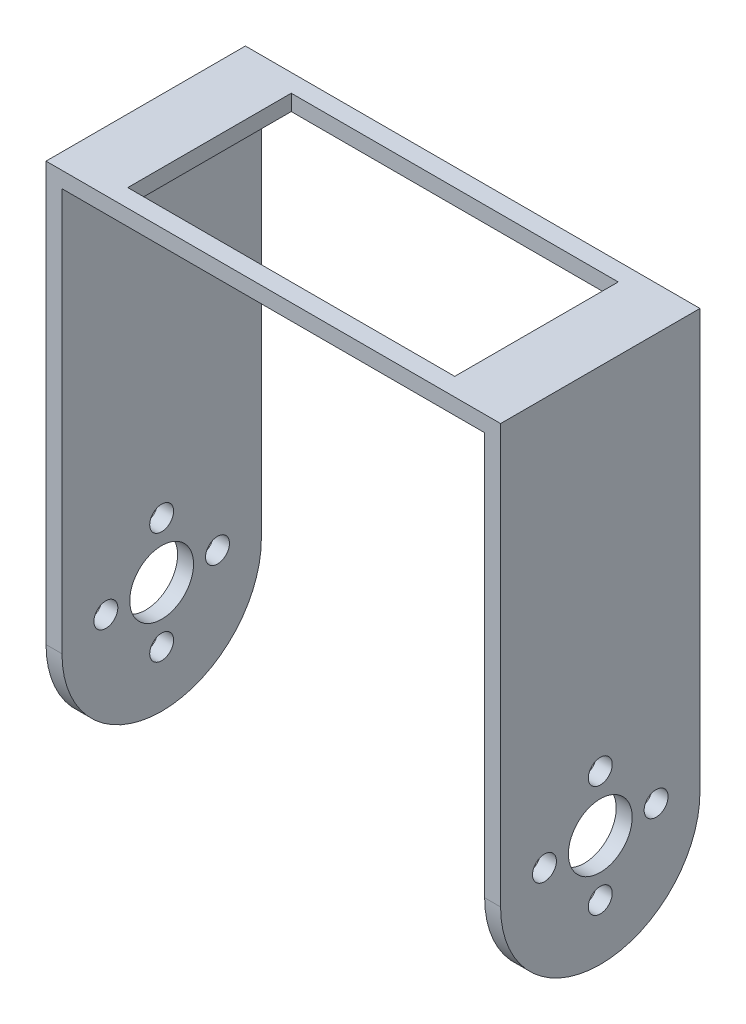
ISO-10303-21;
HEADER;
FILE_DESCRIPTION(('STEP AP214'),'2;1');
FILE_NAME('part.step','',(''),(''),'','','');
FILE_SCHEMA(('AUTOMOTIVE_DESIGN { 1 0 10303 214 1 1 1 1 }'));
ENDSEC;
DATA;
#1=APPLICATION_CONTEXT('core data for automotive mechanical design processes');
#2=APPLICATION_PROTOCOL_DEFINITION('international standard','automotive_design',2000,#1);
#3=PRODUCT_CONTEXT('',#1,'mechanical');
#4=PRODUCT('Part','Part','',(#3));
#5=PRODUCT_RELATED_PRODUCT_CATEGORY('part','',(#4));
#6=PRODUCT_DEFINITION_FORMATION('','',#4);
#7=PRODUCT_DEFINITION_CONTEXT('part definition',#1,'design');
#8=PRODUCT_DEFINITION('design','',#6,#7);
#9=PRODUCT_DEFINITION_SHAPE('','',#8);
#10=(LENGTH_UNIT() NAMED_UNIT(*) SI_UNIT(.MILLI.,.METRE.));
#11=(NAMED_UNIT(*) PLANE_ANGLE_UNIT() SI_UNIT($,.RADIAN.));
#12=(NAMED_UNIT(*) SI_UNIT($,.STERADIAN.) SOLID_ANGLE_UNIT());
#13=UNCERTAINTY_MEASURE_WITH_UNIT(LENGTH_MEASURE(1.E-05),#10,'distance_accuracy_value','');
#14=(GEOMETRIC_REPRESENTATION_CONTEXT(3) GLOBAL_UNCERTAINTY_ASSIGNED_CONTEXT((#13)) GLOBAL_UNIT_ASSIGNED_CONTEXT((#10,
#11,#12)) REPRESENTATION_CONTEXT('',''));
#15=CARTESIAN_POINT('',(0.,0.,0.));
#16=DIRECTION('',(0.,0.,1.));
#17=DIRECTION('',(1.,0.,0.));
#18=AXIS2_PLACEMENT_3D('',#15,#16,#17);
#19=CARTESIAN_POINT('',(-79.925523148209,43.3899538371544,25.));
#20=DIRECTION('',(-1.,0.,0.));
#21=DIRECTION('',(0.,0.,1.));
#22=AXIS2_PLACEMENT_3D('',#19,#20,#21);
#23=PLANE('',#22);
#24=CARTESIAN_POINT('',(-79.925523148209,-5.61350156427675,19.5000009937423));
#25=DIRECTION('',(-1.,0.,0.));
#26=DIRECTION('',(0.,0.,1.));
#27=AXIS2_PLACEMENT_3D('',#24,#25,#26);
#28=CIRCLE('',#27,1.5);
#29=CARTESIAN_POINT('',(-79.925523148209,-5.61350156427675,21.0000009937423));
#30=VERTEX_POINT('',#29);
#31=EDGE_CURVE('E168',#30,#30,#28,.T.);
#32=ORIENTED_EDGE('',*,*,#31,.T.);
#33=EDGE_LOOP('',(#32));
#34=FACE_BOUND('',#33,.T.);
#35=CARTESIAN_POINT('',(-79.925523148209,-12.6135015642767,12.5000009937423));
#36=DIRECTION('',(-1.,0.,0.));
#37=DIRECTION('',(0.,0.,1.));
#38=AXIS2_PLACEMENT_3D('',#35,#36,#37);
#39=CIRCLE('',#38,1.5);
#40=CARTESIAN_POINT('',(-79.925523148209,-12.6135015642767,14.0000009937423));
#41=VERTEX_POINT('',#40);
#42=EDGE_CURVE('E180',#41,#41,#39,.T.);
#43=ORIENTED_EDGE('',*,*,#42,.T.);
#44=EDGE_LOOP('',(#43));
#45=FACE_BOUND('',#44,.T.);
#46=CARTESIAN_POINT('',(-79.925523148209,-5.61350156427665,5.50000099374234));
#47=DIRECTION('',(-1.,0.,0.));
#48=DIRECTION('',(0.,0.,1.));
#49=AXIS2_PLACEMENT_3D('',#46,#47,#48);
#50=CIRCLE('',#49,1.5);
#51=CARTESIAN_POINT('',(-79.925523148209,-5.61350156427665,7.00000099374234));
#52=VERTEX_POINT('',#51);
#53=EDGE_CURVE('E192',#52,#52,#50,.T.);
#54=ORIENTED_EDGE('',*,*,#53,.T.);
#55=EDGE_LOOP('',(#54));
#56=FACE_BOUND('',#55,.T.);
#57=CARTESIAN_POINT('',(-79.925523148209,1.38649843572328,12.5000009937424));
#58=DIRECTION('',(-1.,0.,0.));
#59=DIRECTION('',(0.,0.,1.));
#60=AXIS2_PLACEMENT_3D('',#57,#58,#59);
#61=CIRCLE('',#60,1.5);
#62=CARTESIAN_POINT('',(-79.925523148209,1.38649843572328,14.0000009937424));
#63=VERTEX_POINT('',#62);
#64=EDGE_CURVE('E204',#63,#63,#61,.T.);
#65=ORIENTED_EDGE('',*,*,#64,.T.);
#66=EDGE_LOOP('',(#65));
#67=FACE_BOUND('',#66,.T.);
#68=CARTESIAN_POINT('',(-79.925523148209,-5.61349741649557,12.5));
#69=DIRECTION('',(-1.,0.,0.));
#70=DIRECTION('',(0.,0.,1.));
#71=AXIS2_PLACEMENT_3D('',#68,#69,#70);
#72=CIRCLE('',#71,4.);
#73=CARTESIAN_POINT('',(-79.925523148209,-5.61349741649557,16.5));
#74=VERTEX_POINT('',#73);
#75=EDGE_CURVE('E230',#74,#74,#72,.T.);
#76=ORIENTED_EDGE('',*,*,#75,.T.);
#77=EDGE_LOOP('',(#76));
#78=FACE_BOUND('',#77,.T.);
#79=DIRECTION('',(0.,1.,0.));
#80=VECTOR('',#79,1.);
#81=CARTESIAN_POINT('',(-79.925523148209,43.3899538371544,25.));
#82=LINE('',#81,#80);
#83=CARTESIAN_POINT('',(-79.925523148209,-7.11349741649558,25.));
#84=VERTEX_POINT('',#83);
#85=CARTESIAN_POINT('',(-79.925523148209,43.3899538371544,25.));
#86=VERTEX_POINT('',#85);
#87=EDGE_CURVE('E234',#84,#86,#82,.T.);
#88=ORIENTED_EDGE('',*,*,#87,.F.);
#89=CARTESIAN_POINT('',(-79.925523148209,-7.11349741649558,12.5));
#90=DIRECTION('',(-1.,0.,0.));
#91=DIRECTION('',(0.,0.,1.));
#92=AXIS2_PLACEMENT_3D('',#89,#90,#91);
#93=CIRCLE('',#92,12.5);
#94=CARTESIAN_POINT('',(-79.925523148209,-7.11349741649558,0.));
#95=VERTEX_POINT('',#94);
#96=EDGE_CURVE('E219',#95,#84,#93,.T.);
#97=ORIENTED_EDGE('',*,*,#96,.F.);
#98=DIRECTION('',(0.,1.,0.));
#99=VECTOR('',#98,1.);
#100=CARTESIAN_POINT('',(-79.925523148209,43.3899538371544,0.));
#101=LINE('',#100,#99);
#102=CARTESIAN_POINT('',(-79.925523148209,43.3899538371544,0.));
#103=VERTEX_POINT('',#102);
#104=EDGE_CURVE('E233',#95,#103,#101,.T.);
#105=ORIENTED_EDGE('',*,*,#104,.T.);
#106=DIRECTION('',(0.,0.,-1.));
#107=VECTOR('',#106,1.);
#108=CARTESIAN_POINT('',(-79.925523148209,43.3899538371544,25.));
#109=LINE('',#108,#107);
#110=EDGE_CURVE('E270',#86,#103,#109,.T.);
#111=ORIENTED_EDGE('',*,*,#110,.F.);
#112=EDGE_LOOP('',(#88,#97,#105,#111));
#113=FACE_BOUND('',#112,.T.);
#114=ADVANCED_FACE('F34',(#34,#45,#56,#67,#78,#113),#23,.F.);
#115=CARTESIAN_POINT('',(-26.925523148209,43.3899538371544,25.));
#116=DIRECTION('',(1.,0.,0.));
#117=DIRECTION('',(0.,1.,0.));
#118=AXIS2_PLACEMENT_3D('',#115,#116,#117);
#119=PLANE('',#118);
#120=CARTESIAN_POINT('',(-26.925523148209,-5.61350156427673,19.5000009937423));
#121=DIRECTION('',(1.,0.,0.));
#122=DIRECTION('',(0.,1.,0.));
#123=AXIS2_PLACEMENT_3D('',#120,#121,#122);
#124=CIRCLE('',#123,1.5);
#125=CARTESIAN_POINT('',(-26.925523148209,-4.11350156427673,19.5000009937423));
#126=VERTEX_POINT('',#125);
#127=EDGE_CURVE('E163',#126,#126,#124,.T.);
#128=ORIENTED_EDGE('',*,*,#127,.T.);
#129=EDGE_LOOP('',(#128));
#130=FACE_BOUND('',#129,.T.);
#131=CARTESIAN_POINT('',(-26.925523148209,-12.6135015642767,12.5000009937423));
#132=DIRECTION('',(1.,0.,0.));
#133=DIRECTION('',(0.,1.,0.));
#134=AXIS2_PLACEMENT_3D('',#131,#132,#133);
#135=CIRCLE('',#134,1.5);
#136=CARTESIAN_POINT('',(-26.925523148209,-11.1135015642767,12.5000009937423));
#137=VERTEX_POINT('',#136);
#138=EDGE_CURVE('E175',#137,#137,#135,.T.);
#139=ORIENTED_EDGE('',*,*,#138,.T.);
#140=EDGE_LOOP('',(#139));
#141=FACE_BOUND('',#140,.T.);
#142=CARTESIAN_POINT('',(-26.925523148209,-5.61350156427663,5.50000099374234));
#143=DIRECTION('',(1.,0.,0.));
#144=DIRECTION('',(0.,1.,0.));
#145=AXIS2_PLACEMENT_3D('',#142,#143,#144);
#146=CIRCLE('',#145,1.5);
#147=CARTESIAN_POINT('',(-26.925523148209,-4.11350156427663,5.50000099374234));
#148=VERTEX_POINT('',#147);
#149=EDGE_CURVE('E187',#148,#148,#146,.T.);
#150=ORIENTED_EDGE('',*,*,#149,.T.);
#151=EDGE_LOOP('',(#150));
#152=FACE_BOUND('',#151,.T.);
#153=CARTESIAN_POINT('',(-26.925523148209,1.3864984357233,12.5000009937424));
#154=DIRECTION('',(1.,0.,0.));
#155=DIRECTION('',(0.,1.,0.));
#156=AXIS2_PLACEMENT_3D('',#153,#154,#155);
#157=CIRCLE('',#156,1.5);
#158=CARTESIAN_POINT('',(-26.925523148209,2.8864984357233,12.5000009937424));
#159=VERTEX_POINT('',#158);
#160=EDGE_CURVE('E199',#159,#159,#157,.T.);
#161=ORIENTED_EDGE('',*,*,#160,.T.);
#162=EDGE_LOOP('',(#161));
#163=FACE_BOUND('',#162,.T.);
#164=CARTESIAN_POINT('',(-26.925523148209,-5.61349741649556,12.5));
#165=DIRECTION('',(1.,0.,0.));
#166=DIRECTION('',(0.,1.,0.));
#167=AXIS2_PLACEMENT_3D('',#164,#165,#166);
#168=CIRCLE('',#167,4.);
#169=CARTESIAN_POINT('',(-26.925523148209,-1.61349741649556,12.5));
#170=VERTEX_POINT('',#169);
#171=EDGE_CURVE('E225',#170,#170,#168,.T.);
#172=ORIENTED_EDGE('',*,*,#171,.T.);
#173=EDGE_LOOP('',(#172));
#174=FACE_BOUND('',#173,.T.);
#175=CARTESIAN_POINT('',(-26.925523148209,-7.11349741649557,12.5));
#176=DIRECTION('',(1.,0.,0.));
#177=DIRECTION('',(0.,1.,0.));
#178=AXIS2_PLACEMENT_3D('',#175,#176,#177);
#179=CIRCLE('',#178,12.5);
#180=CARTESIAN_POINT('',(-26.925523148209,-7.11349741649557,25.));
#181=VERTEX_POINT('',#180);
#182=CARTESIAN_POINT('',(-26.925523148209,-7.11349741649558,0.));
#183=VERTEX_POINT('',#182);
#184=EDGE_CURVE('E217',#181,#183,#179,.T.);
#185=ORIENTED_EDGE('',*,*,#184,.F.);
#186=DIRECTION('',(0.,-1.,0.));
#187=VECTOR('',#186,1.);
#188=CARTESIAN_POINT('',(-26.925523148209,43.3899538371544,25.));
#189=LINE('',#188,#187);
#190=CARTESIAN_POINT('',(-26.925523148209,43.3899538371544,25.));
#191=VERTEX_POINT('',#190);
#192=EDGE_CURVE('E239',#191,#181,#189,.T.);
#193=ORIENTED_EDGE('',*,*,#192,.F.);
#194=DIRECTION('',(0.,0.,-1.));
#195=VECTOR('',#194,1.);
#196=CARTESIAN_POINT('',(-26.925523148209,43.3899538371544,25.));
#197=LINE('',#196,#195);
#198=CARTESIAN_POINT('',(-26.925523148209,43.3899538371544,0.));
#199=VERTEX_POINT('',#198);
#200=EDGE_CURVE('E267',#191,#199,#197,.T.);
#201=ORIENTED_EDGE('',*,*,#200,.T.);
#202=DIRECTION('',(0.,-1.,0.));
#203=VECTOR('',#202,1.);
#204=CARTESIAN_POINT('',(-26.925523148209,43.3899538371544,0.));
#205=LINE('',#204,#203);
#206=EDGE_CURVE('E253',#199,#183,#205,.T.);
#207=ORIENTED_EDGE('',*,*,#206,.T.);
#208=EDGE_LOOP('',(#185,#193,#201,#207));
#209=FACE_BOUND('',#208,.T.);
#210=ADVANCED_FACE('F302',(#130,#141,#152,#163,#174,#209),#119,.F.);
#211=CARTESIAN_POINT('',(-24.925523148209,45.3865025835044,25.));
#212=DIRECTION('',(-1.,0.,0.));
#213=DIRECTION('',(0.,-1.,0.));
#214=AXIS2_PLACEMENT_3D('',#211,#212,#213);
#215=PLANE('',#214);
#216=CARTESIAN_POINT('',(-24.925523148209,-5.61350156427673,19.5000009937423));
#217=DIRECTION('',(1.,0.,0.));
#218=DIRECTION('',(0.,1.,0.));
#219=AXIS2_PLACEMENT_3D('',#216,#217,#218);
#220=CIRCLE('',#219,1.5);
#221=CARTESIAN_POINT('',(-24.925523148209,-4.11350156427673,19.5000009937423));
#222=VERTEX_POINT('',#221);
#223=EDGE_CURVE('E159',#222,#222,#220,.T.);
#224=ORIENTED_EDGE('',*,*,#223,.F.);
#225=EDGE_LOOP('',(#224));
#226=FACE_BOUND('',#225,.T.);
#227=CARTESIAN_POINT('',(-24.925523148209,-12.6135015642767,12.5000009937423));
#228=DIRECTION('',(1.,0.,0.));
#229=DIRECTION('',(0.,1.,0.));
#230=AXIS2_PLACEMENT_3D('',#227,#228,#229);
#231=CIRCLE('',#230,1.5);
#232=CARTESIAN_POINT('',(-24.925523148209,-11.1135015642767,12.5000009937423));
#233=VERTEX_POINT('',#232);
#234=EDGE_CURVE('E171',#233,#233,#231,.T.);
#235=ORIENTED_EDGE('',*,*,#234,.F.);
#236=EDGE_LOOP('',(#235));
#237=FACE_BOUND('',#236,.T.);
#238=CARTESIAN_POINT('',(-24.925523148209,-5.61350156427663,5.50000099374234));
#239=DIRECTION('',(1.,0.,0.));
#240=DIRECTION('',(0.,1.,0.));
#241=AXIS2_PLACEMENT_3D('',#238,#239,#240);
#242=CIRCLE('',#241,1.5);
#243=CARTESIAN_POINT('',(-24.925523148209,-4.11350156427663,5.50000099374234));
#244=VERTEX_POINT('',#243);
#245=EDGE_CURVE('E183',#244,#244,#242,.T.);
#246=ORIENTED_EDGE('',*,*,#245,.F.);
#247=EDGE_LOOP('',(#246));
#248=FACE_BOUND('',#247,.T.);
#249=CARTESIAN_POINT('',(-24.925523148209,1.3864984357233,12.5000009937424));
#250=DIRECTION('',(1.,0.,0.));
#251=DIRECTION('',(0.,1.,0.));
#252=AXIS2_PLACEMENT_3D('',#249,#250,#251);
#253=CIRCLE('',#252,1.5);
#254=CARTESIAN_POINT('',(-24.925523148209,2.8864984357233,12.5000009937424));
#255=VERTEX_POINT('',#254);
#256=EDGE_CURVE('E195',#255,#255,#253,.T.);
#257=ORIENTED_EDGE('',*,*,#256,.F.);
#258=EDGE_LOOP('',(#257));
#259=FACE_BOUND('',#258,.T.);
#260=CARTESIAN_POINT('',(-24.9255231482089,-5.61349741649556,12.5));
#261=DIRECTION('',(-1.,0.,0.));
#262=DIRECTION('',(0.,-1.,0.));
#263=AXIS2_PLACEMENT_3D('',#260,#261,#262);
#264=CIRCLE('',#263,4.);
#265=CARTESIAN_POINT('',(-24.9255231482089,-9.61349741649556,12.5));
#266=VERTEX_POINT('',#265);
#267=EDGE_CURVE('E222',#266,#266,#264,.T.);
#268=ORIENTED_EDGE('',*,*,#267,.T.);
#269=EDGE_LOOP('',(#268));
#270=FACE_BOUND('',#269,.T.);
#271=DIRECTION('',(0.,1.,0.));
#272=VECTOR('',#271,1.);
#273=CARTESIAN_POINT('',(-24.925523148209,45.3865025835044,25.));
#274=LINE('',#273,#272);
#275=CARTESIAN_POINT('',(-24.9255231482089,-7.11349741649557,25.));
#276=VERTEX_POINT('',#275);
#277=CARTESIAN_POINT('',(-24.925523148209,45.3865025835044,25.));
#278=VERTEX_POINT('',#277);
#279=EDGE_CURVE('E242',#276,#278,#274,.T.);
#280=ORIENTED_EDGE('',*,*,#279,.F.);
#281=CARTESIAN_POINT('',(-24.9255231482089,-7.11349741649557,12.5));
#282=DIRECTION('',(-1.,0.,0.));
#283=DIRECTION('',(0.,-1.,0.));
#284=AXIS2_PLACEMENT_3D('',#281,#282,#283);
#285=CIRCLE('',#284,12.5);
#286=CARTESIAN_POINT('',(-24.9255231482089,-7.11349741649557,0.));
#287=VERTEX_POINT('',#286);
#288=EDGE_CURVE('E211',#287,#276,#285,.T.);
#289=ORIENTED_EDGE('',*,*,#288,.F.);
#290=DIRECTION('',(0.,1.,0.));
#291=VECTOR('',#290,1.);
#292=CARTESIAN_POINT('',(-24.925523148209,45.3865025835044,0.));
#293=LINE('',#292,#291);
#294=CARTESIAN_POINT('',(-24.925523148209,45.3865025835044,0.));
#295=VERTEX_POINT('',#294);
#296=EDGE_CURVE('E256',#287,#295,#293,.T.);
#297=ORIENTED_EDGE('',*,*,#296,.T.);
#298=DIRECTION('',(0.,0.,-1.));
#299=VECTOR('',#298,1.);
#300=CARTESIAN_POINT('',(-24.925523148209,45.3865025835044,25.));
#301=LINE('',#300,#299);
#302=EDGE_CURVE('E264',#278,#295,#301,.T.);
#303=ORIENTED_EDGE('',*,*,#302,.F.);
#304=EDGE_LOOP('',(#280,#289,#297,#303));
#305=FACE_BOUND('',#304,.T.);
#306=ADVANCED_FACE('F292',(#226,#237,#248,#259,#270,#305),#215,.F.);
#307=CARTESIAN_POINT('',(-81.925523148209,45.3865025835044,25.));
#308=DIRECTION('',(1.,0.,0.));
#309=DIRECTION('',(0.,1.,0.));
#310=AXIS2_PLACEMENT_3D('',#307,#308,#309);
#311=PLANE('',#310);
#312=CARTESIAN_POINT('',(-81.925523148209,-5.61350156427675,19.5000009937423));
#313=DIRECTION('',(1.,0.,0.));
#314=DIRECTION('',(0.,1.,0.));
#315=AXIS2_PLACEMENT_3D('',#312,#313,#314);
#316=CIRCLE('',#315,1.5);
#317=CARTESIAN_POINT('',(-81.925523148209,-4.11350156427675,19.5000009937423));
#318=VERTEX_POINT('',#317);
#319=EDGE_CURVE('E160',#318,#318,#316,.T.);
#320=ORIENTED_EDGE('',*,*,#319,.T.);
#321=EDGE_LOOP('',(#320));
#322=FACE_BOUND('',#321,.T.);
#323=CARTESIAN_POINT('',(-81.925523148209,-12.6135015642767,12.5000009937423));
#324=DIRECTION('',(1.,0.,0.));
#325=DIRECTION('',(0.,1.,0.));
#326=AXIS2_PLACEMENT_3D('',#323,#324,#325);
#327=CIRCLE('',#326,1.5);
#328=CARTESIAN_POINT('',(-81.925523148209,-11.1135015642767,12.5000009937423));
#329=VERTEX_POINT('',#328);
#330=EDGE_CURVE('E172',#329,#329,#327,.T.);
#331=ORIENTED_EDGE('',*,*,#330,.T.);
#332=EDGE_LOOP('',(#331));
#333=FACE_BOUND('',#332,.T.);
#334=CARTESIAN_POINT('',(-81.925523148209,-5.61350156427665,5.50000099374234));
#335=DIRECTION('',(1.,0.,0.));
#336=DIRECTION('',(0.,1.,0.));
#337=AXIS2_PLACEMENT_3D('',#334,#335,#336);
#338=CIRCLE('',#337,1.5);
#339=CARTESIAN_POINT('',(-81.925523148209,-4.11350156427665,5.50000099374234));
#340=VERTEX_POINT('',#339);
#341=EDGE_CURVE('E184',#340,#340,#338,.T.);
#342=ORIENTED_EDGE('',*,*,#341,.T.);
#343=EDGE_LOOP('',(#342));
#344=FACE_BOUND('',#343,.T.);
#345=CARTESIAN_POINT('',(-81.925523148209,1.38649843572328,12.5000009937424));
#346=DIRECTION('',(1.,0.,0.));
#347=DIRECTION('',(0.,1.,0.));
#348=AXIS2_PLACEMENT_3D('',#345,#346,#347);
#349=CIRCLE('',#348,1.5);
#350=CARTESIAN_POINT('',(-81.925523148209,2.88649843572328,12.5000009937424));
#351=VERTEX_POINT('',#350);
#352=EDGE_CURVE('E196',#351,#351,#349,.T.);
#353=ORIENTED_EDGE('',*,*,#352,.T.);
#354=EDGE_LOOP('',(#353));
#355=FACE_BOUND('',#354,.T.);
#356=CARTESIAN_POINT('',(-81.925523148209,-5.61349741649557,12.5));
#357=DIRECTION('',(-1.,0.,0.));
#358=DIRECTION('',(0.,-1.,0.));
#359=AXIS2_PLACEMENT_3D('',#356,#357,#358);
#360=CIRCLE('',#359,4.);
#361=CARTESIAN_POINT('',(-81.925523148209,-9.61349741649557,12.5));
#362=VERTEX_POINT('',#361);
#363=EDGE_CURVE('E221',#362,#362,#360,.T.);
#364=ORIENTED_EDGE('',*,*,#363,.F.);
#365=EDGE_LOOP('',(#364));
#366=FACE_BOUND('',#365,.T.);
#367=CARTESIAN_POINT('',(-81.925523148209,-7.11349741649558,12.5));
#368=DIRECTION('',(-1.,0.,0.));
#369=DIRECTION('',(0.,-1.,0.));
#370=AXIS2_PLACEMENT_3D('',#367,#368,#369);
#371=CIRCLE('',#370,12.5);
#372=CARTESIAN_POINT('',(-81.925523148209,-7.11349741649558,0.));
#373=VERTEX_POINT('',#372);
#374=CARTESIAN_POINT('',(-81.925523148209,-7.11349741649558,25.));
#375=VERTEX_POINT('',#374);
#376=EDGE_CURVE('E210',#373,#375,#371,.T.);
#377=ORIENTED_EDGE('',*,*,#376,.T.);
#378=DIRECTION('',(0.,-1.,0.));
#379=VECTOR('',#378,1.);
#380=CARTESIAN_POINT('',(-81.925523148209,45.3865025835044,25.));
#381=LINE('',#380,#379);
#382=CARTESIAN_POINT('',(-81.925523148209,45.3865025835044,25.));
#383=VERTEX_POINT('',#382);
#384=EDGE_CURVE('E246',#383,#375,#381,.T.);
#385=ORIENTED_EDGE('',*,*,#384,.F.);
#386=DIRECTION('',(0.,0.,-1.));
#387=VECTOR('',#386,1.);
#388=CARTESIAN_POINT('',(-81.925523148209,45.3865025835044,25.));
#389=LINE('',#388,#387);
#390=CARTESIAN_POINT('',(-81.925523148209,45.3865025835044,0.));
#391=VERTEX_POINT('',#390);
#392=EDGE_CURVE('E249',#383,#391,#389,.T.);
#393=ORIENTED_EDGE('',*,*,#392,.T.);
#394=DIRECTION('',(0.,-1.,0.));
#395=VECTOR('',#394,1.);
#396=CARTESIAN_POINT('',(-81.925523148209,45.3865025835044,0.));
#397=LINE('',#396,#395);
#398=EDGE_CURVE('E237',#391,#373,#397,.T.);
#399=ORIENTED_EDGE('',*,*,#398,.T.);
#400=EDGE_LOOP('',(#377,#385,#393,#399));
#401=FACE_BOUND('',#400,.T.);
#402=ADVANCED_FACE('F283',(#322,#333,#344,#355,#366,#401),#311,.F.);
#403=CARTESIAN_POINT('',(-79.925523148209,43.3899538371544,25.));
#404=DIRECTION('',(0.,1.,0.));
#405=DIRECTION('',(0.,0.,1.));
#406=AXIS2_PLACEMENT_3D('',#403,#404,#405);
#407=PLANE('',#406);
#408=DIRECTION('',(1.,0.,0.));
#409=VECTOR('',#408,1.);
#410=CARTESIAN_POINT('',(-79.925523148209,43.3899538371544,22.75));
#411=LINE('',#410,#409);
#412=CARTESIAN_POINT('',(-73.925523148209,43.3899538371544,22.75));
#413=VERTEX_POINT('',#412);
#414=CARTESIAN_POINT('',(-32.925523148209,43.3899538371544,22.75));
#415=VERTEX_POINT('',#414);
#416=EDGE_CURVE('E153',#413,#415,#411,.T.);
#417=ORIENTED_EDGE('',*,*,#416,.T.);
#418=DIRECTION('',(0.,0.,-1.));
#419=VECTOR('',#418,1.);
#420=CARTESIAN_POINT('',(-32.925523148209,43.3899538371544,25.));
#421=LINE('',#420,#419);
#422=CARTESIAN_POINT('',(-32.925523148209,43.3899538371544,2.25));
#423=VERTEX_POINT('',#422);
#424=EDGE_CURVE('E156',#415,#423,#421,.T.);
#425=ORIENTED_EDGE('',*,*,#424,.T.);
#426=DIRECTION('',(-1.,0.,0.));
#427=VECTOR('',#426,1.);
#428=CARTESIAN_POINT('',(-79.925523148209,43.3899538371544,2.25));
#429=LINE('',#428,#427);
#430=CARTESIAN_POINT('',(-73.925523148209,43.3899538371544,2.25));
#431=VERTEX_POINT('',#430);
#432=EDGE_CURVE('E148',#423,#431,#429,.T.);
#433=ORIENTED_EDGE('',*,*,#432,.T.);
#434=DIRECTION('',(0.,0.,1.));
#435=VECTOR('',#434,1.);
#436=CARTESIAN_POINT('',(-73.925523148209,43.3899538371544,25.));
#437=LINE('',#436,#435);
#438=EDGE_CURVE('E128',#431,#413,#437,.T.);
#439=ORIENTED_EDGE('',*,*,#438,.T.);
#440=EDGE_LOOP('',(#417,#425,#433,#439));
#441=FACE_BOUND('',#440,.T.);
#442=DIRECTION('',(1.,0.,0.));
#443=VECTOR('',#442,1.);
#444=CARTESIAN_POINT('',(-79.925523148209,43.3899538371544,0.));
#445=LINE('',#444,#443);
#446=EDGE_CURVE('E251',#103,#199,#445,.T.);
#447=ORIENTED_EDGE('',*,*,#446,.T.);
#448=ORIENTED_EDGE('',*,*,#200,.F.);
#449=DIRECTION('',(1.,0.,0.));
#450=VECTOR('',#449,1.);
#451=CARTESIAN_POINT('',(-79.925523148209,43.3899538371544,25.));
#452=LINE('',#451,#450);
#453=EDGE_CURVE('E236',#86,#191,#452,.T.);
#454=ORIENTED_EDGE('',*,*,#453,.F.);
#455=ORIENTED_EDGE('',*,*,#110,.T.);
#456=EDGE_LOOP('',(#447,#448,#454,#455));
#457=FACE_BOUND('',#456,.T.);
#458=ADVANCED_FACE('F305',(#441,#457),#407,.F.);
#459=CARTESIAN_POINT('',(-81.925523148209,45.3865025835044,25.));
#460=DIRECTION('',(0.,-1.,0.));
#461=DIRECTION('',(0.,0.,-1.));
#462=AXIS2_PLACEMENT_3D('',#459,#460,#461);
#463=PLANE('',#462);
#464=DIRECTION('',(-1.,0.,0.));
#465=VECTOR('',#464,1.);
#466=CARTESIAN_POINT('',(-73.925523148209,45.3865025835044,2.25));
#467=LINE('',#466,#465);
#468=CARTESIAN_POINT('',(-32.925523148209,45.3865025835044,2.25));
#469=VERTEX_POINT('',#468);
#470=CARTESIAN_POINT('',(-73.925523148209,45.3865025835044,2.25));
#471=VERTEX_POINT('',#470);
#472=EDGE_CURVE('E134',#469,#471,#467,.T.);
#473=ORIENTED_EDGE('',*,*,#472,.F.);
#474=DIRECTION('',(0.,0.,-1.));
#475=VECTOR('',#474,1.);
#476=CARTESIAN_POINT('',(-32.925523148209,45.3865025835044,2.25));
#477=LINE('',#476,#475);
#478=CARTESIAN_POINT('',(-32.925523148209,45.3865025835044,22.75));
#479=VERTEX_POINT('',#478);
#480=EDGE_CURVE('E56',#479,#469,#477,.T.);
#481=ORIENTED_EDGE('',*,*,#480,.F.);
#482=DIRECTION('',(1.,0.,0.));
#483=VECTOR('',#482,1.);
#484=CARTESIAN_POINT('',(-73.925523148209,45.3865025835044,22.75));
#485=LINE('',#484,#483);
#486=CARTESIAN_POINT('',(-73.925523148209,45.3865025835044,22.75));
#487=VERTEX_POINT('',#486);
#488=EDGE_CURVE('E141',#487,#479,#485,.T.);
#489=ORIENTED_EDGE('',*,*,#488,.F.);
#490=DIRECTION('',(0.,0.,1.));
#491=VECTOR('',#490,1.);
#492=CARTESIAN_POINT('',(-73.925523148209,45.3865025835044,2.25));
#493=LINE('',#492,#491);
#494=EDGE_CURVE('E125',#471,#487,#493,.T.);
#495=ORIENTED_EDGE('',*,*,#494,.F.);
#496=EDGE_LOOP('',(#473,#481,#489,#495));
#497=FACE_BOUND('',#496,.T.);
#498=DIRECTION('',(-1.,0.,0.));
#499=VECTOR('',#498,1.);
#500=CARTESIAN_POINT('',(-81.925523148209,45.3865025835044,0.));
#501=LINE('',#500,#499);
#502=EDGE_CURVE('E258',#295,#391,#501,.T.);
#503=ORIENTED_EDGE('',*,*,#502,.T.);
#504=ORIENTED_EDGE('',*,*,#392,.F.);
#505=DIRECTION('',(-1.,0.,0.));
#506=VECTOR('',#505,1.);
#507=CARTESIAN_POINT('',(-27.0429671921119,45.3865025835044,25.));
#508=LINE('',#507,#506);
#509=EDGE_CURVE('E244',#278,#383,#508,.T.);
#510=ORIENTED_EDGE('',*,*,#509,.F.);
#511=ORIENTED_EDGE('',*,*,#302,.T.);
#512=EDGE_LOOP('',(#503,#504,#510,#511));
#513=FACE_BOUND('',#512,.T.);
#514=ADVANCED_FACE('F138',(#497,#513),#463,.F.);
#515=CARTESIAN_POINT('',(0.,0.,25.));
#516=DIRECTION('',(0.,0.,1.));
#517=DIRECTION('',(1.,0.,0.));
#518=AXIS2_PLACEMENT_3D('',#515,#516,#517);
#519=PLANE('',#518);
#520=DIRECTION('',(-1.,0.,0.));
#521=VECTOR('',#520,1.);
#522=CARTESIAN_POINT('',(-24.9255231482089,-7.11349741649557,25.));
#523=LINE('',#522,#521);
#524=EDGE_CURVE('E207',#276,#181,#523,.T.);
#525=ORIENTED_EDGE('',*,*,#524,.F.);
#526=ORIENTED_EDGE('',*,*,#279,.T.);
#527=ORIENTED_EDGE('',*,*,#509,.T.);
#528=ORIENTED_EDGE('',*,*,#384,.T.);
#529=DIRECTION('',(-1.,0.,0.));
#530=VECTOR('',#529,1.);
#531=CARTESIAN_POINT('',(-24.9255231482089,-7.11349741649557,25.));
#532=LINE('',#531,#530);
#533=EDGE_CURVE('E11',#84,#375,#532,.T.);
#534=ORIENTED_EDGE('',*,*,#533,.F.);
#535=ORIENTED_EDGE('',*,*,#87,.T.);
#536=ORIENTED_EDGE('',*,*,#453,.T.);
#537=ORIENTED_EDGE('',*,*,#192,.T.);
#538=EDGE_LOOP('',(#525,#526,#527,#528,#534,#535,#536,#537));
#539=FACE_BOUND('',#538,.T.);
#540=ADVANCED_FACE('F297',(#539),#519,.T.);
#541=CARTESIAN_POINT('',(0.,0.,0.));
#542=DIRECTION('',(0.,0.,1.));
#543=DIRECTION('',(1.,0.,0.));
#544=AXIS2_PLACEMENT_3D('',#541,#542,#543);
#545=PLANE('',#544);
#546=ORIENTED_EDGE('',*,*,#296,.F.);
#547=DIRECTION('',(-1.,0.,0.));
#548=VECTOR('',#547,1.);
#549=CARTESIAN_POINT('',(-24.9255231482089,-7.11349741649557,0.));
#550=LINE('',#549,#548);
#551=EDGE_CURVE('E213',#287,#183,#550,.T.);
#552=ORIENTED_EDGE('',*,*,#551,.T.);
#553=ORIENTED_EDGE('',*,*,#206,.F.);
#554=ORIENTED_EDGE('',*,*,#446,.F.);
#555=ORIENTED_EDGE('',*,*,#104,.F.);
#556=DIRECTION('',(-1.,0.,0.));
#557=VECTOR('',#556,1.);
#558=CARTESIAN_POINT('',(-24.9255231482089,-7.11349741649557,0.));
#559=LINE('',#558,#557);
#560=EDGE_CURVE('E41',#95,#373,#559,.T.);
#561=ORIENTED_EDGE('',*,*,#560,.T.);
#562=ORIENTED_EDGE('',*,*,#398,.F.);
#563=ORIENTED_EDGE('',*,*,#502,.F.);
#564=EDGE_LOOP('',(#546,#552,#553,#554,#555,#561,#562,#563));
#565=FACE_BOUND('',#564,.T.);
#566=ADVANCED_FACE('F277',(#565),#545,.F.);
#567=CARTESIAN_POINT('',(-24.9255231482089,-5.61349741649556,12.5));
#568=DIRECTION('',(-1.,0.,0.));
#569=DIRECTION('',(0.,-1.,0.));
#570=AXIS2_PLACEMENT_3D('',#567,#568,#569);
#571=CYLINDRICAL_SURFACE('',#570,4.);
#572=ORIENTED_EDGE('',*,*,#363,.T.);
#573=EDGE_LOOP('',(#572));
#574=FACE_BOUND('',#573,.T.);
#575=ORIENTED_EDGE('',*,*,#75,.F.);
#576=EDGE_LOOP('',(#575));
#577=FACE_BOUND('',#576,.T.);
#578=ADVANCED_FACE('F318',(#574,#577),#571,.F.);
#579=ORIENTED_EDGE('',*,*,#267,.F.);
#580=EDGE_LOOP('',(#579));
#581=FACE_BOUND('',#580,.T.);
#582=ORIENTED_EDGE('',*,*,#171,.F.);
#583=EDGE_LOOP('',(#582));
#584=FACE_BOUND('',#583,.T.);
#585=ADVANCED_FACE('F311',(#581,#584),#571,.F.);
#586=CARTESIAN_POINT('',(-24.9255231482089,-7.11349741649557,12.5));
#587=DIRECTION('',(-1.,0.,0.));
#588=DIRECTION('',(0.,-1.,0.));
#589=AXIS2_PLACEMENT_3D('',#586,#587,#588);
#590=CYLINDRICAL_SURFACE('',#589,12.5);
#591=ORIENTED_EDGE('',*,*,#96,.T.);
#592=ORIENTED_EDGE('',*,*,#533,.T.);
#593=ORIENTED_EDGE('',*,*,#376,.F.);
#594=ORIENTED_EDGE('',*,*,#560,.F.);
#595=EDGE_LOOP('',(#591,#592,#593,#594));
#596=FACE_BOUND('',#595,.T.);
#597=ADVANCED_FACE('F309',(#596),#590,.T.);
#598=ORIENTED_EDGE('',*,*,#184,.T.);
#599=ORIENTED_EDGE('',*,*,#551,.F.);
#600=ORIENTED_EDGE('',*,*,#288,.T.);
#601=ORIENTED_EDGE('',*,*,#524,.T.);
#602=EDGE_LOOP('',(#598,#599,#600,#601));
#603=FACE_BOUND('',#602,.T.);
#604=ADVANCED_FACE('F295',(#603),#590,.T.);
#605=CARTESIAN_POINT('',(-81.925523148209,1.38649843572328,12.5000009937424));
#606=DIRECTION('',(1.,0.,0.));
#607=DIRECTION('',(0.,1.,0.));
#608=AXIS2_PLACEMENT_3D('',#605,#606,#607);
#609=CYLINDRICAL_SURFACE('',#608,1.5);
#610=ORIENTED_EDGE('',*,*,#352,.F.);
#611=EDGE_LOOP('',(#610));
#612=FACE_BOUND('',#611,.T.);
#613=ORIENTED_EDGE('',*,*,#64,.F.);
#614=EDGE_LOOP('',(#613));
#615=FACE_BOUND('',#614,.T.);
#616=ADVANCED_FACE('F317',(#612,#615),#609,.F.);
#617=ORIENTED_EDGE('',*,*,#256,.T.);
#618=EDGE_LOOP('',(#617));
#619=FACE_BOUND('',#618,.T.);
#620=ORIENTED_EDGE('',*,*,#160,.F.);
#621=EDGE_LOOP('',(#620));
#622=FACE_BOUND('',#621,.T.);
#623=ADVANCED_FACE('F387',(#619,#622),#609,.F.);
#624=CARTESIAN_POINT('',(-81.925523148209,-5.61350156427665,5.50000099374234));
#625=DIRECTION('',(1.,0.,0.));
#626=DIRECTION('',(0.,1.,0.));
#627=AXIS2_PLACEMENT_3D('',#624,#625,#626);
#628=CYLINDRICAL_SURFACE('',#627,1.5);
#629=ORIENTED_EDGE('',*,*,#341,.F.);
#630=EDGE_LOOP('',(#629));
#631=FACE_BOUND('',#630,.T.);
#632=ORIENTED_EDGE('',*,*,#53,.F.);
#633=EDGE_LOOP('',(#632));
#634=FACE_BOUND('',#633,.T.);
#635=ADVANCED_FACE('F385',(#631,#634),#628,.F.);
#636=ORIENTED_EDGE('',*,*,#245,.T.);
#637=EDGE_LOOP('',(#636));
#638=FACE_BOUND('',#637,.T.);
#639=ORIENTED_EDGE('',*,*,#149,.F.);
#640=EDGE_LOOP('',(#639));
#641=FACE_BOUND('',#640,.T.);
#642=ADVANCED_FACE('F383',(#638,#641),#628,.F.);
#643=CARTESIAN_POINT('',(-81.925523148209,-12.6135015642767,12.5000009937423));
#644=DIRECTION('',(1.,0.,0.));
#645=DIRECTION('',(0.,1.,0.));
#646=AXIS2_PLACEMENT_3D('',#643,#644,#645);
#647=CYLINDRICAL_SURFACE('',#646,1.5);
#648=ORIENTED_EDGE('',*,*,#330,.F.);
#649=EDGE_LOOP('',(#648));
#650=FACE_BOUND('',#649,.T.);
#651=ORIENTED_EDGE('',*,*,#42,.F.);
#652=EDGE_LOOP('',(#651));
#653=FACE_BOUND('',#652,.T.);
#654=ADVANCED_FACE('F380',(#650,#653),#647,.F.);
#655=ORIENTED_EDGE('',*,*,#234,.T.);
#656=EDGE_LOOP('',(#655));
#657=FACE_BOUND('',#656,.T.);
#658=ORIENTED_EDGE('',*,*,#138,.F.);
#659=EDGE_LOOP('',(#658));
#660=FACE_BOUND('',#659,.T.);
#661=ADVANCED_FACE('F378',(#657,#660),#647,.F.);
#662=CARTESIAN_POINT('',(-81.925523148209,-5.61350156427675,19.5000009937423));
#663=DIRECTION('',(1.,0.,0.));
#664=DIRECTION('',(0.,1.,0.));
#665=AXIS2_PLACEMENT_3D('',#662,#663,#664);
#666=CYLINDRICAL_SURFACE('',#665,1.5);
#667=ORIENTED_EDGE('',*,*,#319,.F.);
#668=EDGE_LOOP('',(#667));
#669=FACE_BOUND('',#668,.T.);
#670=ORIENTED_EDGE('',*,*,#31,.F.);
#671=EDGE_LOOP('',(#670));
#672=FACE_BOUND('',#671,.T.);
#673=ADVANCED_FACE('F371',(#669,#672),#666,.F.);
#674=ORIENTED_EDGE('',*,*,#223,.T.);
#675=EDGE_LOOP('',(#674));
#676=FACE_BOUND('',#675,.T.);
#677=ORIENTED_EDGE('',*,*,#127,.F.);
#678=EDGE_LOOP('',(#677));
#679=FACE_BOUND('',#678,.T.);
#680=ADVANCED_FACE('F364',(#676,#679),#666,.F.);
#681=CARTESIAN_POINT('',(-32.925523148209,35.3865025835044,2.25));
#682=DIRECTION('',(1.,0.,0.));
#683=DIRECTION('',(0.,0.,-1.));
#684=AXIS2_PLACEMENT_3D('',#681,#682,#683);
#685=PLANE('',#684);
#686=DIRECTION('',(0.,1.,0.));
#687=VECTOR('',#686,1.);
#688=CARTESIAN_POINT('',(-32.925523148209,35.3865025835044,22.75));
#689=LINE('',#688,#687);
#690=EDGE_CURVE('E146',#415,#479,#689,.T.);
#691=ORIENTED_EDGE('',*,*,#690,.T.);
#692=ORIENTED_EDGE('',*,*,#480,.T.);
#693=DIRECTION('',(0.,1.,0.));
#694=VECTOR('',#693,1.);
#695=CARTESIAN_POINT('',(-32.925523148209,35.3865025835044,2.25));
#696=LINE('',#695,#694);
#697=EDGE_CURVE('E131',#423,#469,#696,.T.);
#698=ORIENTED_EDGE('',*,*,#697,.F.);
#699=ORIENTED_EDGE('',*,*,#424,.F.);
#700=EDGE_LOOP('',(#691,#692,#698,#699));
#701=FACE_BOUND('',#700,.T.);
#702=ADVANCED_FACE('F362',(#701),#685,.F.);
#703=CARTESIAN_POINT('',(-73.925523148209,35.3865025835044,22.75));
#704=DIRECTION('',(0.,0.,1.));
#705=DIRECTION('',(1.,0.,0.));
#706=AXIS2_PLACEMENT_3D('',#703,#704,#705);
#707=PLANE('',#706);
#708=DIRECTION('',(0.,1.,0.));
#709=VECTOR('',#708,1.);
#710=CARTESIAN_POINT('',(-73.925523148209,35.3865025835044,22.75));
#711=LINE('',#710,#709);
#712=EDGE_CURVE('E130',#413,#487,#711,.T.);
#713=ORIENTED_EDGE('',*,*,#712,.T.);
#714=ORIENTED_EDGE('',*,*,#488,.T.);
#715=ORIENTED_EDGE('',*,*,#690,.F.);
#716=ORIENTED_EDGE('',*,*,#416,.F.);
#717=EDGE_LOOP('',(#713,#714,#715,#716));
#718=FACE_BOUND('',#717,.T.);
#719=ADVANCED_FACE('F361',(#718),#707,.F.);
#720=CARTESIAN_POINT('',(-73.925523148209,35.3865025835044,2.25));
#721=DIRECTION('',(-1.,0.,0.));
#722=DIRECTION('',(0.,0.,1.));
#723=AXIS2_PLACEMENT_3D('',#720,#721,#722);
#724=PLANE('',#723);
#725=DIRECTION('',(0.,1.,0.));
#726=VECTOR('',#725,1.);
#727=CARTESIAN_POINT('',(-73.925523148209,35.3865025835044,2.25));
#728=LINE('',#727,#726);
#729=EDGE_CURVE('E48',#431,#471,#728,.T.);
#730=ORIENTED_EDGE('',*,*,#729,.T.);
#731=ORIENTED_EDGE('',*,*,#494,.T.);
#732=ORIENTED_EDGE('',*,*,#712,.F.);
#733=ORIENTED_EDGE('',*,*,#438,.F.);
#734=EDGE_LOOP('',(#730,#731,#732,#733));
#735=FACE_BOUND('',#734,.T.);
#736=ADVANCED_FACE('F122',(#735),#724,.F.);
#737=CARTESIAN_POINT('',(-73.925523148209,35.3865025835044,2.25));
#738=DIRECTION('',(0.,0.,-1.));
#739=DIRECTION('',(-1.,0.,0.));
#740=AXIS2_PLACEMENT_3D('',#737,#738,#739);
#741=PLANE('',#740);
#742=ORIENTED_EDGE('',*,*,#697,.T.);
#743=ORIENTED_EDGE('',*,*,#472,.T.);
#744=ORIENTED_EDGE('',*,*,#729,.F.);
#745=ORIENTED_EDGE('',*,*,#432,.F.);
#746=EDGE_LOOP('',(#742,#743,#744,#745));
#747=FACE_BOUND('',#746,.T.);
#748=ADVANCED_FACE('F135',(#747),#741,.F.);
#749=CLOSED_SHELL('',(#114,#210,#306,#402,#458,#514,#540,#566,#578,#585,#597,#604,#616,#623,
#635,#642,#654,#661,#673,#680,#702,#719,#736,#748));
#750=MANIFOLD_SOLID_BREP('B2',#749);
#751=ADVANCED_BREP_SHAPE_REPRESENTATION('',(#18,#750),#14);
#752=SHAPE_DEFINITION_REPRESENTATION(#9,#751);
ENDSEC;
END-ISO-10303-21;
